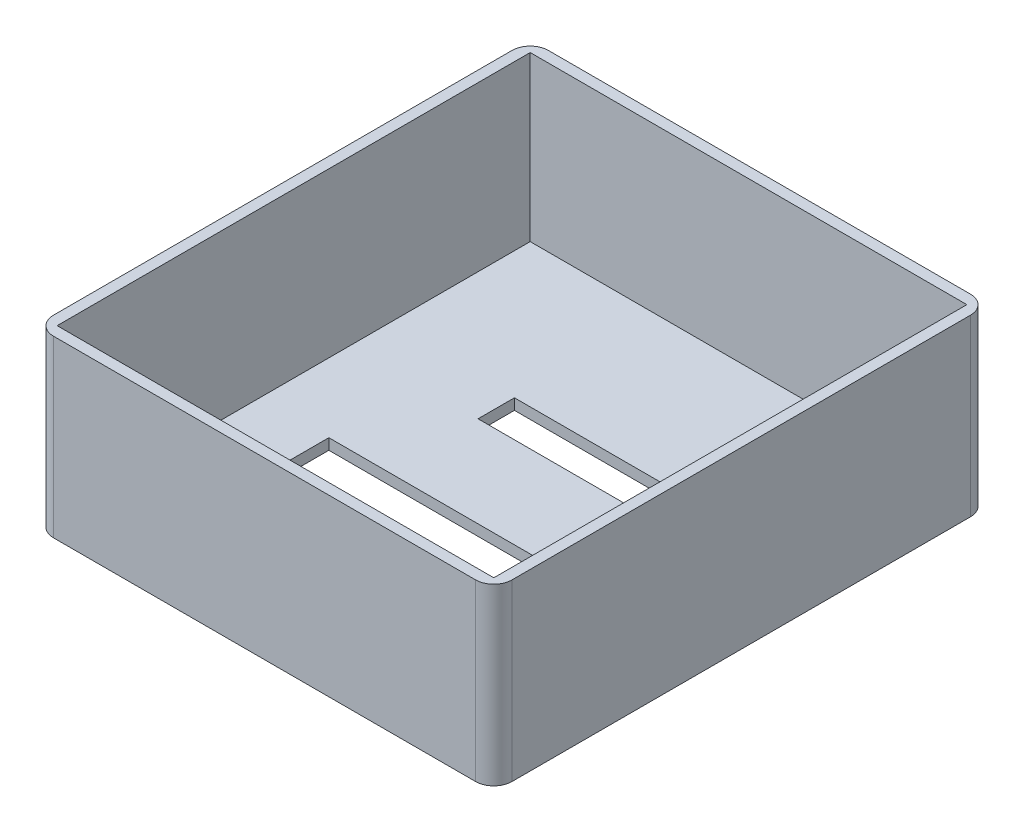
ISO-10303-21;
HEADER;
FILE_DESCRIPTION(('STEP AP214'),'2;1');
FILE_NAME('part.step','',(''),(''),'','','');
FILE_SCHEMA(('AUTOMOTIVE_DESIGN { 1 0 10303 214 1 1 1 1 }'));
ENDSEC;
DATA;
#1=APPLICATION_CONTEXT('core data for automotive mechanical design processes');
#2=APPLICATION_PROTOCOL_DEFINITION('international standard','automotive_design',2000,#1);
#3=PRODUCT_CONTEXT('',#1,'mechanical');
#4=PRODUCT('Part','Part','',(#3));
#5=PRODUCT_RELATED_PRODUCT_CATEGORY('part','',(#4));
#6=PRODUCT_DEFINITION_FORMATION('','',#4);
#7=PRODUCT_DEFINITION_CONTEXT('part definition',#1,'design');
#8=PRODUCT_DEFINITION('design','',#6,#7);
#9=PRODUCT_DEFINITION_SHAPE('','',#8);
#10=(LENGTH_UNIT() NAMED_UNIT(*) SI_UNIT(.MILLI.,.METRE.));
#11=(NAMED_UNIT(*) PLANE_ANGLE_UNIT() SI_UNIT($,.RADIAN.));
#12=(NAMED_UNIT(*) SI_UNIT($,.STERADIAN.) SOLID_ANGLE_UNIT());
#13=UNCERTAINTY_MEASURE_WITH_UNIT(LENGTH_MEASURE(1.E-05),#10,'distance_accuracy_value','');
#14=(GEOMETRIC_REPRESENTATION_CONTEXT(3) GLOBAL_UNCERTAINTY_ASSIGNED_CONTEXT((#13)) GLOBAL_UNIT_ASSIGNED_CONTEXT((#10,
#11,#12)) REPRESENTATION_CONTEXT('',''));
#15=CARTESIAN_POINT('',(0.,0.,0.));
#16=DIRECTION('',(0.,0.,1.));
#17=DIRECTION('',(1.,0.,0.));
#18=AXIS2_PLACEMENT_3D('',#15,#16,#17);
#19=CARTESIAN_POINT('',(63.,3.,-68.));
#20=DIRECTION('',(-1.,0.,0.));
#21=DIRECTION('',(0.,0.,1.));
#22=AXIS2_PLACEMENT_3D('',#19,#20,#21);
#23=PLANE('',#22);
#24=DIRECTION('',(0.,0.,-1.));
#25=VECTOR('',#24,1.);
#26=CARTESIAN_POINT('',(63.,0.,-68.));
#27=LINE('',#26,#25);
#28=CARTESIAN_POINT('',(63.,0.,63.));
#29=VERTEX_POINT('',#28);
#30=CARTESIAN_POINT('',(63.,0.,-63.));
#31=VERTEX_POINT('',#30);
#32=EDGE_CURVE('E273',#29,#31,#27,.T.);
#33=ORIENTED_EDGE('',*,*,#32,.T.);
#34=DIRECTION('',(0.,-1.,0.));
#35=VECTOR('',#34,1.);
#36=CARTESIAN_POINT('',(63.,3.,-63.));
#37=LINE('',#36,#35);
#38=CARTESIAN_POINT('',(63.,48.,-63.));
#39=VERTEX_POINT('',#38);
#40=EDGE_CURVE('E314',#31,#39,#37,.F.);
#41=ORIENTED_EDGE('',*,*,#40,.T.);
#42=DIRECTION('',(0.,0.,-1.));
#43=VECTOR('',#42,1.);
#44=CARTESIAN_POINT('',(63.,48.,-68.));
#45=LINE('',#44,#43);
#46=CARTESIAN_POINT('',(63.,48.,63.));
#47=VERTEX_POINT('',#46);
#48=EDGE_CURVE('E267',#47,#39,#45,.T.);
#49=ORIENTED_EDGE('',*,*,#48,.F.);
#50=DIRECTION('',(0.,-1.,0.));
#51=VECTOR('',#50,1.);
#52=CARTESIAN_POINT('',(63.,3.,63.));
#53=LINE('',#52,#51);
#54=EDGE_CURVE('E311',#47,#29,#53,.T.);
#55=ORIENTED_EDGE('',*,*,#54,.T.);
#56=EDGE_LOOP('',(#33,#41,#49,#55));
#57=FACE_BOUND('',#56,.T.);
#58=ADVANCED_FACE('F35',(#57),#23,.F.);
#59=CARTESIAN_POINT('',(-63.,3.,-68.));
#60=DIRECTION('',(0.,0.,1.));
#61=DIRECTION('',(1.,0.,0.));
#62=AXIS2_PLACEMENT_3D('',#59,#60,#61);
#63=PLANE('',#62);
#64=DIRECTION('',(-1.,0.,0.));
#65=VECTOR('',#64,1.);
#66=CARTESIAN_POINT('',(-63.,0.,-68.));
#67=LINE('',#66,#65);
#68=CARTESIAN_POINT('',(58.,0.,-68.));
#69=VERTEX_POINT('',#68);
#70=CARTESIAN_POINT('',(-58.,0.,-68.));
#71=VERTEX_POINT('',#70);
#72=EDGE_CURVE('E276',#69,#71,#67,.T.);
#73=ORIENTED_EDGE('',*,*,#72,.T.);
#74=DIRECTION('',(0.,-1.,0.));
#75=VECTOR('',#74,1.);
#76=CARTESIAN_POINT('',(-58.,3.,-68.));
#77=LINE('',#76,#75);
#78=CARTESIAN_POINT('',(-58.,48.,-68.));
#79=VERTEX_POINT('',#78);
#80=EDGE_CURVE('E301',#71,#79,#77,.F.);
#81=ORIENTED_EDGE('',*,*,#80,.T.);
#82=DIRECTION('',(-1.,0.,0.));
#83=VECTOR('',#82,1.);
#84=CARTESIAN_POINT('',(-63.,48.,-68.));
#85=LINE('',#84,#83);
#86=CARTESIAN_POINT('',(58.,48.,-68.));
#87=VERTEX_POINT('',#86);
#88=EDGE_CURVE('E270',#87,#79,#85,.T.);
#89=ORIENTED_EDGE('',*,*,#88,.F.);
#90=DIRECTION('',(0.,-1.,0.));
#91=VECTOR('',#90,1.);
#92=CARTESIAN_POINT('',(58.,3.,-68.));
#93=LINE('',#92,#91);
#94=EDGE_CURVE('E298',#87,#69,#93,.T.);
#95=ORIENTED_EDGE('',*,*,#94,.T.);
#96=EDGE_LOOP('',(#73,#81,#89,#95));
#97=FACE_BOUND('',#96,.T.);
#98=ADVANCED_FACE('F342',(#97),#63,.F.);
#99=CARTESIAN_POINT('',(-63.,3.,-68.));
#100=DIRECTION('',(1.,0.,0.));
#101=DIRECTION('',(0.,0.,-1.));
#102=AXIS2_PLACEMENT_3D('',#99,#100,#101);
#103=PLANE('',#102);
#104=DIRECTION('',(0.,0.,1.));
#105=VECTOR('',#104,1.);
#106=CARTESIAN_POINT('',(-63.,48.,-68.));
#107=LINE('',#106,#105);
#108=CARTESIAN_POINT('',(-63.,48.,-63.));
#109=VERTEX_POINT('',#108);
#110=CARTESIAN_POINT('',(-63.,48.,63.));
#111=VERTEX_POINT('',#110);
#112=EDGE_CURVE('E261',#109,#111,#107,.T.);
#113=ORIENTED_EDGE('',*,*,#112,.F.);
#114=DIRECTION('',(0.,-1.,0.));
#115=VECTOR('',#114,1.);
#116=CARTESIAN_POINT('',(-63.,3.,-63.));
#117=LINE('',#116,#115);
#118=CARTESIAN_POINT('',(-63.,0.,-63.));
#119=VERTEX_POINT('',#118);
#120=EDGE_CURVE('E287',#109,#119,#117,.T.);
#121=ORIENTED_EDGE('',*,*,#120,.T.);
#122=DIRECTION('',(0.,0.,1.));
#123=VECTOR('',#122,1.);
#124=CARTESIAN_POINT('',(-63.,0.,-68.));
#125=LINE('',#124,#123);
#126=CARTESIAN_POINT('',(-63.,0.,63.));
#127=VERTEX_POINT('',#126);
#128=EDGE_CURVE('E279',#119,#127,#125,.T.);
#129=ORIENTED_EDGE('',*,*,#128,.T.);
#130=DIRECTION('',(0.,-1.,0.));
#131=VECTOR('',#130,1.);
#132=CARTESIAN_POINT('',(-63.,3.,63.));
#133=LINE('',#132,#131);
#134=EDGE_CURVE('E285',#127,#111,#133,.F.);
#135=ORIENTED_EDGE('',*,*,#134,.T.);
#136=EDGE_LOOP('',(#113,#121,#129,#135));
#137=FACE_BOUND('',#136,.T.);
#138=ADVANCED_FACE('F348',(#137),#103,.F.);
#139=CARTESIAN_POINT('',(-63.,3.,68.));
#140=DIRECTION('',(0.,0.,-1.));
#141=DIRECTION('',(-1.,0.,0.));
#142=AXIS2_PLACEMENT_3D('',#139,#140,#141);
#143=PLANE('',#142);
#144=DIRECTION('',(1.,0.,0.));
#145=VECTOR('',#144,1.);
#146=CARTESIAN_POINT('',(-63.,0.,68.));
#147=LINE('',#146,#145);
#148=CARTESIAN_POINT('',(-58.,0.,68.));
#149=VERTEX_POINT('',#148);
#150=CARTESIAN_POINT('',(58.,0.,68.));
#151=VERTEX_POINT('',#150);
#152=EDGE_CURVE('E282',#149,#151,#147,.T.);
#153=ORIENTED_EDGE('',*,*,#152,.T.);
#154=DIRECTION('',(0.,-1.,0.));
#155=VECTOR('',#154,1.);
#156=CARTESIAN_POINT('',(58.,3.,68.));
#157=LINE('',#156,#155);
#158=CARTESIAN_POINT('',(58.,48.,68.));
#159=VERTEX_POINT('',#158);
#160=EDGE_CURVE('E319',#151,#159,#157,.F.);
#161=ORIENTED_EDGE('',*,*,#160,.T.);
#162=DIRECTION('',(1.,0.,0.));
#163=VECTOR('',#162,1.);
#164=CARTESIAN_POINT('',(-63.,48.,68.));
#165=LINE('',#164,#163);
#166=CARTESIAN_POINT('',(-58.,48.,68.));
#167=VERTEX_POINT('',#166);
#168=EDGE_CURVE('E264',#167,#159,#165,.T.);
#169=ORIENTED_EDGE('',*,*,#168,.F.);
#170=DIRECTION('',(0.,-1.,0.));
#171=VECTOR('',#170,1.);
#172=CARTESIAN_POINT('',(-58.,3.,68.));
#173=LINE('',#172,#171);
#174=EDGE_CURVE('E316',#167,#149,#173,.T.);
#175=ORIENTED_EDGE('',*,*,#174,.T.);
#176=EDGE_LOOP('',(#153,#161,#169,#175));
#177=FACE_BOUND('',#176,.T.);
#178=ADVANCED_FACE('F392',(#177),#143,.F.);
#179=CARTESIAN_POINT('',(0.,0.,0.));
#180=DIRECTION('',(0.,1.,0.));
#181=DIRECTION('',(0.,0.,1.));
#182=AXIS2_PLACEMENT_3D('',#179,#180,#181);
#183=PLANE('',#182);
#184=DIRECTION('',(-1.,0.,0.));
#185=VECTOR('',#184,1.);
#186=CARTESIAN_POINT('',(0.,0.,9.32848748235913));
#187=LINE('',#186,#185);
#188=CARTESIAN_POINT('',(41.,0.,9.32848748235912));
#189=VERTEX_POINT('',#188);
#190=CARTESIAN_POINT('',(-41.,0.,9.32848748235914));
#191=VERTEX_POINT('',#190);
#192=EDGE_CURVE('E43',#189,#191,#187,.T.);
#193=ORIENTED_EDGE('',*,*,#192,.T.);
#194=DIRECTION('',(0.,0.,1.));
#195=VECTOR('',#194,1.);
#196=CARTESIAN_POINT('',(-41.,0.,0.));
#197=LINE('',#196,#195);
#198=CARTESIAN_POINT('',(-41.,0.,32.3284874823591));
#199=VERTEX_POINT('',#198);
#200=EDGE_CURVE('E11',#191,#199,#197,.T.);
#201=ORIENTED_EDGE('',*,*,#200,.T.);
#202=DIRECTION('',(1.,0.,0.));
#203=VECTOR('',#202,1.);
#204=CARTESIAN_POINT('',(0.,0.,32.3284874823591));
#205=LINE('',#204,#203);
#206=CARTESIAN_POINT('',(41.,0.,32.3284874823591));
#207=VERTEX_POINT('',#206);
#208=EDGE_CURVE('E177',#199,#207,#205,.T.);
#209=ORIENTED_EDGE('',*,*,#208,.T.);
#210=DIRECTION('',(0.,0.,-1.));
#211=VECTOR('',#210,1.);
#212=CARTESIAN_POINT('',(41.,0.,0.));
#213=LINE('',#212,#211);
#214=EDGE_CURVE('E322',#207,#189,#213,.T.);
#215=ORIENTED_EDGE('',*,*,#214,.T.);
#216=EDGE_LOOP('',(#193,#201,#209,#215));
#217=FACE_BOUND('',#216,.T.);
#218=DIRECTION('',(-1.,0.,0.));
#219=VECTOR('',#218,1.);
#220=CARTESIAN_POINT('',(0.,0.,-25.6715125176409));
#221=LINE('',#220,#219);
#222=CARTESIAN_POINT('',(25.,0.,-25.6715125176409));
#223=VERTEX_POINT('',#222);
#224=CARTESIAN_POINT('',(-25.,0.,-25.6715125176409));
#225=VERTEX_POINT('',#224);
#226=EDGE_CURVE('E226',#223,#225,#221,.T.);
#227=ORIENTED_EDGE('',*,*,#226,.T.);
#228=DIRECTION('',(0.,0.,1.));
#229=VECTOR('',#228,1.);
#230=CARTESIAN_POINT('',(-25.,0.,0.));
#231=LINE('',#230,#229);
#232=CARTESIAN_POINT('',(-25.,0.,-15.6715125176409));
#233=VERTEX_POINT('',#232);
#234=EDGE_CURVE('E229',#225,#233,#231,.T.);
#235=ORIENTED_EDGE('',*,*,#234,.T.);
#236=DIRECTION('',(1.,0.,0.));
#237=VECTOR('',#236,1.);
#238=CARTESIAN_POINT('',(0.,0.,-15.6715125176409));
#239=LINE('',#238,#237);
#240=CARTESIAN_POINT('',(25.,0.,-15.6715125176409));
#241=VERTEX_POINT('',#240);
#242=EDGE_CURVE('E199',#233,#241,#239,.T.);
#243=ORIENTED_EDGE('',*,*,#242,.T.);
#244=DIRECTION('',(0.,0.,-1.));
#245=VECTOR('',#244,1.);
#246=CARTESIAN_POINT('',(25.,0.,0.));
#247=LINE('',#246,#245);
#248=EDGE_CURVE('E223',#241,#223,#247,.T.);
#249=ORIENTED_EDGE('',*,*,#248,.T.);
#250=EDGE_LOOP('',(#227,#235,#243,#249));
#251=FACE_BOUND('',#250,.T.);
#252=ORIENTED_EDGE('',*,*,#128,.F.);
#253=CARTESIAN_POINT('',(-58.,0.,-63.));
#254=DIRECTION('',(0.,1.,0.));
#255=DIRECTION('',(0.,0.,1.));
#256=AXIS2_PLACEMENT_3D('',#253,#254,#255);
#257=CIRCLE('',#256,5.);
#258=EDGE_CURVE('E296',#119,#71,#257,.F.);
#259=ORIENTED_EDGE('',*,*,#258,.T.);
#260=ORIENTED_EDGE('',*,*,#72,.F.);
#261=CARTESIAN_POINT('',(58.,0.,-63.));
#262=DIRECTION('',(0.,1.,0.));
#263=DIRECTION('',(0.,0.,1.));
#264=AXIS2_PLACEMENT_3D('',#261,#262,#263);
#265=CIRCLE('',#264,5.);
#266=EDGE_CURVE('E294',#69,#31,#265,.F.);
#267=ORIENTED_EDGE('',*,*,#266,.T.);
#268=ORIENTED_EDGE('',*,*,#32,.F.);
#269=CARTESIAN_POINT('',(58.,0.,63.));
#270=DIRECTION('',(0.,1.,0.));
#271=DIRECTION('',(0.,0.,1.));
#272=AXIS2_PLACEMENT_3D('',#269,#270,#271);
#273=CIRCLE('',#272,5.);
#274=EDGE_CURVE('E292',#29,#151,#273,.F.);
#275=ORIENTED_EDGE('',*,*,#274,.T.);
#276=ORIENTED_EDGE('',*,*,#152,.F.);
#277=CARTESIAN_POINT('',(-58.,0.,63.));
#278=DIRECTION('',(0.,1.,0.));
#279=DIRECTION('',(0.,0.,1.));
#280=AXIS2_PLACEMENT_3D('',#277,#278,#279);
#281=CIRCLE('',#280,5.);
#282=EDGE_CURVE('E290',#149,#127,#281,.F.);
#283=ORIENTED_EDGE('',*,*,#282,.T.);
#284=EDGE_LOOP('',(#252,#259,#260,#267,#268,#275,#276,#283));
#285=FACE_BOUND('',#284,.T.);
#286=ADVANCED_FACE('F326',(#217,#251,#285),#183,.F.);
#287=CARTESIAN_POINT('',(0.,48.,0.));
#288=DIRECTION('',(0.,1.,0.));
#289=DIRECTION('',(0.,0.,1.));
#290=AXIS2_PLACEMENT_3D('',#287,#288,#289);
#291=PLANE('',#290);
#292=ORIENTED_EDGE('',*,*,#88,.T.);
#293=CARTESIAN_POINT('',(-58.,48.,-63.));
#294=DIRECTION('',(0.,1.,0.));
#295=DIRECTION('',(0.,0.,1.));
#296=AXIS2_PLACEMENT_3D('',#293,#294,#295);
#297=CIRCLE('',#296,5.);
#298=EDGE_CURVE('E309',#79,#109,#297,.T.);
#299=ORIENTED_EDGE('',*,*,#298,.T.);
#300=ORIENTED_EDGE('',*,*,#112,.T.);
#301=CARTESIAN_POINT('',(-58.,48.,63.));
#302=DIRECTION('',(0.,1.,0.));
#303=DIRECTION('',(0.,0.,1.));
#304=AXIS2_PLACEMENT_3D('',#301,#302,#303);
#305=CIRCLE('',#304,5.);
#306=EDGE_CURVE('E303',#111,#167,#305,.T.);
#307=ORIENTED_EDGE('',*,*,#306,.T.);
#308=ORIENTED_EDGE('',*,*,#168,.T.);
#309=CARTESIAN_POINT('',(58.,48.,63.));
#310=DIRECTION('',(0.,1.,0.));
#311=DIRECTION('',(0.,0.,1.));
#312=AXIS2_PLACEMENT_3D('',#309,#310,#311);
#313=CIRCLE('',#312,5.);
#314=EDGE_CURVE('E305',#159,#47,#313,.T.);
#315=ORIENTED_EDGE('',*,*,#314,.T.);
#316=ORIENTED_EDGE('',*,*,#48,.T.);
#317=CARTESIAN_POINT('',(58.,48.,-63.));
#318=DIRECTION('',(0.,1.,0.));
#319=DIRECTION('',(0.,0.,1.));
#320=AXIS2_PLACEMENT_3D('',#317,#318,#319);
#321=CIRCLE('',#320,5.);
#322=EDGE_CURVE('E307',#39,#87,#321,.T.);
#323=ORIENTED_EDGE('',*,*,#322,.T.);
#324=EDGE_LOOP('',(#292,#299,#300,#307,#308,#315,#316,#323));
#325=FACE_BOUND('',#324,.T.);
#326=DIRECTION('',(-1.,0.,0.));
#327=VECTOR('',#326,1.);
#328=CARTESIAN_POINT('',(-60.,48.,-65.));
#329=LINE('',#328,#327);
#330=CARTESIAN_POINT('',(60.,48.,-65.));
#331=VERTEX_POINT('',#330);
#332=CARTESIAN_POINT('',(-60.,48.,-65.));
#333=VERTEX_POINT('',#332);
#334=EDGE_CURVE('E235',#331,#333,#329,.T.);
#335=ORIENTED_EDGE('',*,*,#334,.F.);
#336=DIRECTION('',(0.,0.,-1.));
#337=VECTOR('',#336,1.);
#338=CARTESIAN_POINT('',(60.,48.,-65.));
#339=LINE('',#338,#337);
#340=CARTESIAN_POINT('',(60.,48.,65.));
#341=VERTEX_POINT('',#340);
#342=EDGE_CURVE('E233',#341,#331,#339,.T.);
#343=ORIENTED_EDGE('',*,*,#342,.F.);
#344=DIRECTION('',(1.,0.,0.));
#345=VECTOR('',#344,1.);
#346=CARTESIAN_POINT('',(-60.,48.,65.));
#347=LINE('',#346,#345);
#348=CARTESIAN_POINT('',(-60.,48.,65.));
#349=VERTEX_POINT('',#348);
#350=EDGE_CURVE('E241',#349,#341,#347,.T.);
#351=ORIENTED_EDGE('',*,*,#350,.F.);
#352=DIRECTION('',(0.,0.,1.));
#353=VECTOR('',#352,1.);
#354=CARTESIAN_POINT('',(-60.,48.,-65.));
#355=LINE('',#354,#353);
#356=EDGE_CURVE('E238',#333,#349,#355,.T.);
#357=ORIENTED_EDGE('',*,*,#356,.F.);
#358=EDGE_LOOP('',(#335,#343,#351,#357));
#359=FACE_BOUND('',#358,.T.);
#360=ADVANCED_FACE('F373',(#325,#359),#291,.T.);
#361=CARTESIAN_POINT('',(60.,48.,-65.));
#362=DIRECTION('',(-1.,0.,0.));
#363=DIRECTION('',(0.,0.,1.));
#364=AXIS2_PLACEMENT_3D('',#361,#362,#363);
#365=PLANE('',#364);
#366=DIRECTION('',(0.,0.,-1.));
#367=VECTOR('',#366,1.);
#368=CARTESIAN_POINT('',(60.,3.,-65.));
#369=LINE('',#368,#367);
#370=CARTESIAN_POINT('',(60.,3.,65.));
#371=VERTEX_POINT('',#370);
#372=CARTESIAN_POINT('',(60.,3.,-65.));
#373=VERTEX_POINT('',#372);
#374=EDGE_CURVE('E232',#371,#373,#369,.T.);
#375=ORIENTED_EDGE('',*,*,#374,.F.);
#376=DIRECTION('',(0.,-1.,0.));
#377=VECTOR('',#376,1.);
#378=CARTESIAN_POINT('',(60.,48.,65.));
#379=LINE('',#378,#377);
#380=EDGE_CURVE('E243',#341,#371,#379,.T.);
#381=ORIENTED_EDGE('',*,*,#380,.F.);
#382=ORIENTED_EDGE('',*,*,#342,.T.);
#383=DIRECTION('',(0.,-1.,0.));
#384=VECTOR('',#383,1.);
#385=CARTESIAN_POINT('',(60.,48.,-65.));
#386=LINE('',#385,#384);
#387=EDGE_CURVE('E258',#331,#373,#386,.T.);
#388=ORIENTED_EDGE('',*,*,#387,.T.);
#389=EDGE_LOOP('',(#375,#381,#382,#388));
#390=FACE_BOUND('',#389,.T.);
#391=ADVANCED_FACE('F401',(#390),#365,.T.);
#392=CARTESIAN_POINT('',(-60.,48.,-65.));
#393=DIRECTION('',(0.,0.,1.));
#394=DIRECTION('',(1.,0.,0.));
#395=AXIS2_PLACEMENT_3D('',#392,#393,#394);
#396=PLANE('',#395);
#397=DIRECTION('',(-1.,0.,0.));
#398=VECTOR('',#397,1.);
#399=CARTESIAN_POINT('',(-60.,3.,-65.));
#400=LINE('',#399,#398);
#401=CARTESIAN_POINT('',(-60.,3.,-65.));
#402=VERTEX_POINT('',#401);
#403=EDGE_CURVE('E245',#373,#402,#400,.T.);
#404=ORIENTED_EDGE('',*,*,#403,.F.);
#405=ORIENTED_EDGE('',*,*,#387,.F.);
#406=ORIENTED_EDGE('',*,*,#334,.T.);
#407=DIRECTION('',(0.,-1.,0.));
#408=VECTOR('',#407,1.);
#409=CARTESIAN_POINT('',(-60.,48.,-65.));
#410=LINE('',#409,#408);
#411=EDGE_CURVE('E255',#333,#402,#410,.T.);
#412=ORIENTED_EDGE('',*,*,#411,.T.);
#413=EDGE_LOOP('',(#404,#405,#406,#412));
#414=FACE_BOUND('',#413,.T.);
#415=ADVANCED_FACE('F532',(#414),#396,.T.);
#416=CARTESIAN_POINT('',(-60.,48.,-65.));
#417=DIRECTION('',(1.,0.,0.));
#418=DIRECTION('',(0.,0.,-1.));
#419=AXIS2_PLACEMENT_3D('',#416,#417,#418);
#420=PLANE('',#419);
#421=DIRECTION('',(0.,0.,1.));
#422=VECTOR('',#421,1.);
#423=CARTESIAN_POINT('',(-60.,3.,-65.));
#424=LINE('',#423,#422);
#425=CARTESIAN_POINT('',(-60.,3.,65.));
#426=VERTEX_POINT('',#425);
#427=EDGE_CURVE('E247',#402,#426,#424,.T.);
#428=ORIENTED_EDGE('',*,*,#427,.F.);
#429=ORIENTED_EDGE('',*,*,#411,.F.);
#430=ORIENTED_EDGE('',*,*,#356,.T.);
#431=DIRECTION('',(0.,-1.,0.));
#432=VECTOR('',#431,1.);
#433=CARTESIAN_POINT('',(-60.,48.,65.));
#434=LINE('',#433,#432);
#435=EDGE_CURVE('E252',#349,#426,#434,.T.);
#436=ORIENTED_EDGE('',*,*,#435,.T.);
#437=EDGE_LOOP('',(#428,#429,#430,#436));
#438=FACE_BOUND('',#437,.T.);
#439=ADVANCED_FACE('F528',(#438),#420,.T.);
#440=CARTESIAN_POINT('',(-60.,48.,65.));
#441=DIRECTION('',(0.,0.,-1.));
#442=DIRECTION('',(-1.,0.,0.));
#443=AXIS2_PLACEMENT_3D('',#440,#441,#442);
#444=PLANE('',#443);
#445=DIRECTION('',(1.,0.,0.));
#446=VECTOR('',#445,1.);
#447=CARTESIAN_POINT('',(-60.,3.,65.));
#448=LINE('',#447,#446);
#449=EDGE_CURVE('E236',#426,#371,#448,.T.);
#450=ORIENTED_EDGE('',*,*,#449,.F.);
#451=ORIENTED_EDGE('',*,*,#435,.F.);
#452=ORIENTED_EDGE('',*,*,#350,.T.);
#453=ORIENTED_EDGE('',*,*,#380,.T.);
#454=EDGE_LOOP('',(#450,#451,#452,#453));
#455=FACE_BOUND('',#454,.T.);
#456=ADVANCED_FACE('F462',(#455),#444,.T.);
#457=CARTESIAN_POINT('',(0.,3.,0.));
#458=DIRECTION('',(0.,1.,0.));
#459=DIRECTION('',(0.,0.,1.));
#460=AXIS2_PLACEMENT_3D('',#457,#458,#459);
#461=PLANE('',#460);
#462=DIRECTION('',(0.,0.,1.));
#463=VECTOR('',#462,1.);
#464=CARTESIAN_POINT('',(-41.,3.,32.3284874823591));
#465=LINE('',#464,#463);
#466=CARTESIAN_POINT('',(-41.,3.,9.32848748235914));
#467=VERTEX_POINT('',#466);
#468=CARTESIAN_POINT('',(-41.,3.,32.3284874823591));
#469=VERTEX_POINT('',#468);
#470=EDGE_CURVE('E182',#467,#469,#465,.T.);
#471=ORIENTED_EDGE('',*,*,#470,.F.);
#472=DIRECTION('',(-1.,0.,0.));
#473=VECTOR('',#472,1.);
#474=CARTESIAN_POINT('',(41.,3.,9.32848748235912));
#475=LINE('',#474,#473);
#476=CARTESIAN_POINT('',(41.,3.,9.32848748235912));
#477=VERTEX_POINT('',#476);
#478=EDGE_CURVE('E179',#477,#467,#475,.T.);
#479=ORIENTED_EDGE('',*,*,#478,.F.);
#480=DIRECTION('',(0.,0.,-1.));
#481=VECTOR('',#480,1.);
#482=CARTESIAN_POINT('',(41.,3.,32.3284874823591));
#483=LINE('',#482,#481);
#484=CARTESIAN_POINT('',(41.,3.,32.3284874823591));
#485=VERTEX_POINT('',#484);
#486=EDGE_CURVE('E193',#485,#477,#483,.T.);
#487=ORIENTED_EDGE('',*,*,#486,.F.);
#488=DIRECTION('',(1.,0.,0.));
#489=VECTOR('',#488,1.);
#490=CARTESIAN_POINT('',(41.,3.,32.3284874823591));
#491=LINE('',#490,#489);
#492=EDGE_CURVE('E174',#469,#485,#491,.T.);
#493=ORIENTED_EDGE('',*,*,#492,.F.);
#494=EDGE_LOOP('',(#471,#479,#487,#493));
#495=FACE_BOUND('',#494,.T.);
#496=DIRECTION('',(0.,0.,1.));
#497=VECTOR('',#496,1.);
#498=CARTESIAN_POINT('',(-25.,3.,-15.6715125176409));
#499=LINE('',#498,#497);
#500=CARTESIAN_POINT('',(-25.,3.,-25.6715125176409));
#501=VERTEX_POINT('',#500);
#502=CARTESIAN_POINT('',(-25.,3.,-15.6715125176409));
#503=VERTEX_POINT('',#502);
#504=EDGE_CURVE('E204',#501,#503,#499,.T.);
#505=ORIENTED_EDGE('',*,*,#504,.F.);
#506=DIRECTION('',(-1.,0.,0.));
#507=VECTOR('',#506,1.);
#508=CARTESIAN_POINT('',(25.,3.,-25.6715125176409));
#509=LINE('',#508,#507);
#510=CARTESIAN_POINT('',(25.,3.,-25.6715125176409));
#511=VERTEX_POINT('',#510);
#512=EDGE_CURVE('E211',#511,#501,#509,.T.);
#513=ORIENTED_EDGE('',*,*,#512,.F.);
#514=DIRECTION('',(0.,0.,-1.));
#515=VECTOR('',#514,1.);
#516=CARTESIAN_POINT('',(25.,3.,-15.6715125176409));
#517=LINE('',#516,#515);
#518=CARTESIAN_POINT('',(25.,3.,-15.6715125176409));
#519=VERTEX_POINT('',#518);
#520=EDGE_CURVE('E208',#519,#511,#517,.T.);
#521=ORIENTED_EDGE('',*,*,#520,.F.);
#522=DIRECTION('',(1.,0.,0.));
#523=VECTOR('',#522,1.);
#524=CARTESIAN_POINT('',(25.,3.,-15.6715125176409));
#525=LINE('',#524,#523);
#526=EDGE_CURVE('E206',#503,#519,#525,.T.);
#527=ORIENTED_EDGE('',*,*,#526,.F.);
#528=EDGE_LOOP('',(#505,#513,#521,#527));
#529=FACE_BOUND('',#528,.T.);
#530=ORIENTED_EDGE('',*,*,#374,.T.);
#531=ORIENTED_EDGE('',*,*,#403,.T.);
#532=ORIENTED_EDGE('',*,*,#427,.T.);
#533=ORIENTED_EDGE('',*,*,#449,.T.);
#534=EDGE_LOOP('',(#530,#531,#532,#533));
#535=FACE_BOUND('',#534,.T.);
#536=ADVANCED_FACE('F191',(#495,#529,#535),#461,.T.);
#537=CARTESIAN_POINT('',(-58.,3.,-63.));
#538=DIRECTION('',(0.,-1.,0.));
#539=DIRECTION('',(0.,0.,-1.));
#540=AXIS2_PLACEMENT_3D('',#537,#538,#539);
#541=CYLINDRICAL_SURFACE('',#540,5.);
#542=ORIENTED_EDGE('',*,*,#298,.F.);
#543=ORIENTED_EDGE('',*,*,#80,.F.);
#544=ORIENTED_EDGE('',*,*,#258,.F.);
#545=ORIENTED_EDGE('',*,*,#120,.F.);
#546=EDGE_LOOP('',(#542,#543,#544,#545));
#547=FACE_BOUND('',#546,.T.);
#548=ADVANCED_FACE('F353',(#547),#541,.T.);
#549=CARTESIAN_POINT('',(58.,3.,-63.));
#550=DIRECTION('',(0.,-1.,0.));
#551=DIRECTION('',(0.,0.,-1.));
#552=AXIS2_PLACEMENT_3D('',#549,#550,#551);
#553=CYLINDRICAL_SURFACE('',#552,5.);
#554=ORIENTED_EDGE('',*,*,#322,.F.);
#555=ORIENTED_EDGE('',*,*,#40,.F.);
#556=ORIENTED_EDGE('',*,*,#266,.F.);
#557=ORIENTED_EDGE('',*,*,#94,.F.);
#558=EDGE_LOOP('',(#554,#555,#556,#557));
#559=FACE_BOUND('',#558,.T.);
#560=ADVANCED_FACE('F356',(#559),#553,.T.);
#561=CARTESIAN_POINT('',(58.,3.,63.));
#562=DIRECTION('',(0.,-1.,0.));
#563=DIRECTION('',(0.,0.,-1.));
#564=AXIS2_PLACEMENT_3D('',#561,#562,#563);
#565=CYLINDRICAL_SURFACE('',#564,5.);
#566=ORIENTED_EDGE('',*,*,#314,.F.);
#567=ORIENTED_EDGE('',*,*,#160,.F.);
#568=ORIENTED_EDGE('',*,*,#274,.F.);
#569=ORIENTED_EDGE('',*,*,#54,.F.);
#570=EDGE_LOOP('',(#566,#567,#568,#569));
#571=FACE_BOUND('',#570,.T.);
#572=ADVANCED_FACE('F359',(#571),#565,.T.);
#573=CARTESIAN_POINT('',(-58.,3.,63.));
#574=DIRECTION('',(0.,-1.,0.));
#575=DIRECTION('',(0.,0.,-1.));
#576=AXIS2_PLACEMENT_3D('',#573,#574,#575);
#577=CYLINDRICAL_SURFACE('',#576,5.);
#578=ORIENTED_EDGE('',*,*,#306,.F.);
#579=ORIENTED_EDGE('',*,*,#134,.F.);
#580=ORIENTED_EDGE('',*,*,#282,.F.);
#581=ORIENTED_EDGE('',*,*,#174,.F.);
#582=EDGE_LOOP('',(#578,#579,#580,#581));
#583=FACE_BOUND('',#582,.T.);
#584=ADVANCED_FACE('F37',(#583),#577,.T.);
#585=CARTESIAN_POINT('',(-25.,-7.,-15.6715125176409));
#586=DIRECTION('',(-1.,0.,0.));
#587=DIRECTION('',(0.,0.,1.));
#588=AXIS2_PLACEMENT_3D('',#585,#586,#587);
#589=PLANE('',#588);
#590=DIRECTION('',(0.,1.,0.));
#591=VECTOR('',#590,1.);
#592=CARTESIAN_POINT('',(-25.,-7.,-25.6715125176409));
#593=LINE('',#592,#591);
#594=EDGE_CURVE('E189',#225,#501,#593,.T.);
#595=ORIENTED_EDGE('',*,*,#594,.T.);
#596=ORIENTED_EDGE('',*,*,#504,.T.);
#597=DIRECTION('',(0.,1.,0.));
#598=VECTOR('',#597,1.);
#599=CARTESIAN_POINT('',(-25.,-7.,-15.6715125176409));
#600=LINE('',#599,#598);
#601=EDGE_CURVE('E214',#233,#503,#600,.T.);
#602=ORIENTED_EDGE('',*,*,#601,.F.);
#603=ORIENTED_EDGE('',*,*,#234,.F.);
#604=EDGE_LOOP('',(#595,#596,#602,#603));
#605=FACE_BOUND('',#604,.T.);
#606=ADVANCED_FACE('F366',(#605),#589,.F.);
#607=CARTESIAN_POINT('',(25.,-7.,-25.6715125176409));
#608=DIRECTION('',(0.,0.,-1.));
#609=DIRECTION('',(-1.,0.,0.));
#610=AXIS2_PLACEMENT_3D('',#607,#608,#609);
#611=PLANE('',#610);
#612=DIRECTION('',(0.,1.,0.));
#613=VECTOR('',#612,1.);
#614=CARTESIAN_POINT('',(25.,-7.,-25.6715125176409));
#615=LINE('',#614,#613);
#616=EDGE_CURVE('E216',#223,#511,#615,.T.);
#617=ORIENTED_EDGE('',*,*,#616,.T.);
#618=ORIENTED_EDGE('',*,*,#512,.T.);
#619=ORIENTED_EDGE('',*,*,#594,.F.);
#620=ORIENTED_EDGE('',*,*,#226,.F.);
#621=EDGE_LOOP('',(#617,#618,#619,#620));
#622=FACE_BOUND('',#621,.T.);
#623=ADVANCED_FACE('F469',(#622),#611,.F.);
#624=CARTESIAN_POINT('',(25.,-7.,-15.6715125176409));
#625=DIRECTION('',(1.,0.,0.));
#626=DIRECTION('',(0.,0.,-1.));
#627=AXIS2_PLACEMENT_3D('',#624,#625,#626);
#628=PLANE('',#627);
#629=DIRECTION('',(0.,1.,0.));
#630=VECTOR('',#629,1.);
#631=CARTESIAN_POINT('',(25.,-7.,-15.6715125176409));
#632=LINE('',#631,#630);
#633=EDGE_CURVE('E58',#241,#519,#632,.T.);
#634=ORIENTED_EDGE('',*,*,#633,.T.);
#635=ORIENTED_EDGE('',*,*,#520,.T.);
#636=ORIENTED_EDGE('',*,*,#616,.F.);
#637=ORIENTED_EDGE('',*,*,#248,.F.);
#638=EDGE_LOOP('',(#634,#635,#636,#637));
#639=FACE_BOUND('',#638,.T.);
#640=ADVANCED_FACE('F479',(#639),#628,.F.);
#641=CARTESIAN_POINT('',(25.,-7.,-15.6715125176409));
#642=DIRECTION('',(0.,0.,1.));
#643=DIRECTION('',(1.,0.,0.));
#644=AXIS2_PLACEMENT_3D('',#641,#642,#643);
#645=PLANE('',#644);
#646=ORIENTED_EDGE('',*,*,#601,.T.);
#647=ORIENTED_EDGE('',*,*,#526,.T.);
#648=ORIENTED_EDGE('',*,*,#633,.F.);
#649=ORIENTED_EDGE('',*,*,#242,.F.);
#650=EDGE_LOOP('',(#646,#647,#648,#649));
#651=FACE_BOUND('',#650,.T.);
#652=ADVANCED_FACE('F489',(#651),#645,.F.);
#653=CARTESIAN_POINT('',(-41.,-7.,32.3284874823591));
#654=DIRECTION('',(-1.,0.,0.));
#655=DIRECTION('',(0.,0.,1.));
#656=AXIS2_PLACEMENT_3D('',#653,#654,#655);
#657=PLANE('',#656);
#658=DIRECTION('',(0.,1.,0.));
#659=VECTOR('',#658,1.);
#660=CARTESIAN_POINT('',(-41.,-7.,9.32848748235914));
#661=LINE('',#660,#659);
#662=EDGE_CURVE('E185',#191,#467,#661,.T.);
#663=ORIENTED_EDGE('',*,*,#662,.T.);
#664=ORIENTED_EDGE('',*,*,#470,.T.);
#665=DIRECTION('',(0.,1.,0.));
#666=VECTOR('',#665,1.);
#667=CARTESIAN_POINT('',(-41.,-7.,32.3284874823591));
#668=LINE('',#667,#666);
#669=EDGE_CURVE('E170',#199,#469,#668,.T.);
#670=ORIENTED_EDGE('',*,*,#669,.F.);
#671=ORIENTED_EDGE('',*,*,#200,.F.);
#672=EDGE_LOOP('',(#663,#664,#670,#671));
#673=FACE_BOUND('',#672,.T.);
#674=ADVANCED_FACE('F183',(#673),#657,.F.);
#675=CARTESIAN_POINT('',(41.,-7.,9.32848748235912));
#676=DIRECTION('',(0.,0.,-1.));
#677=DIRECTION('',(-1.,0.,0.));
#678=AXIS2_PLACEMENT_3D('',#675,#676,#677);
#679=PLANE('',#678);
#680=DIRECTION('',(0.,1.,0.));
#681=VECTOR('',#680,1.);
#682=CARTESIAN_POINT('',(41.,-7.,9.32848748235912));
#683=LINE('',#682,#681);
#684=EDGE_CURVE('E200',#189,#477,#683,.T.);
#685=ORIENTED_EDGE('',*,*,#684,.T.);
#686=ORIENTED_EDGE('',*,*,#478,.T.);
#687=ORIENTED_EDGE('',*,*,#662,.F.);
#688=ORIENTED_EDGE('',*,*,#192,.F.);
#689=EDGE_LOOP('',(#685,#686,#687,#688));
#690=FACE_BOUND('',#689,.T.);
#691=ADVANCED_FACE('F330',(#690),#679,.F.);
#692=CARTESIAN_POINT('',(41.,-7.,32.3284874823591));
#693=DIRECTION('',(1.,0.,0.));
#694=DIRECTION('',(0.,0.,-1.));
#695=AXIS2_PLACEMENT_3D('',#692,#693,#694);
#696=PLANE('',#695);
#697=DIRECTION('',(0.,1.,0.));
#698=VECTOR('',#697,1.);
#699=CARTESIAN_POINT('',(41.,-7.,32.3284874823591));
#700=LINE('',#699,#698);
#701=EDGE_CURVE('E50',#207,#485,#700,.T.);
#702=ORIENTED_EDGE('',*,*,#701,.T.);
#703=ORIENTED_EDGE('',*,*,#486,.T.);
#704=ORIENTED_EDGE('',*,*,#684,.F.);
#705=ORIENTED_EDGE('',*,*,#214,.F.);
#706=EDGE_LOOP('',(#702,#703,#704,#705));
#707=FACE_BOUND('',#706,.T.);
#708=ADVANCED_FACE('F332',(#707),#696,.F.);
#709=CARTESIAN_POINT('',(41.,-7.,32.3284874823591));
#710=DIRECTION('',(0.,0.,1.));
#711=DIRECTION('',(1.,0.,0.));
#712=AXIS2_PLACEMENT_3D('',#709,#710,#711);
#713=PLANE('',#712);
#714=ORIENTED_EDGE('',*,*,#669,.T.);
#715=ORIENTED_EDGE('',*,*,#492,.T.);
#716=ORIENTED_EDGE('',*,*,#701,.F.);
#717=ORIENTED_EDGE('',*,*,#208,.F.);
#718=EDGE_LOOP('',(#714,#715,#716,#717));
#719=FACE_BOUND('',#718,.T.);
#720=ADVANCED_FACE('F172',(#719),#713,.F.);
#721=CLOSED_SHELL('',(#58,#98,#138,#178,#286,#360,#391,#415,#439,#456,#536,#548,#560,#572,#584,
#606,#623,#640,#652,#674,#691,#708,#720));
#722=MANIFOLD_SOLID_BREP('B2',#721);
#723=ADVANCED_BREP_SHAPE_REPRESENTATION('',(#18,#722),#14);
#724=SHAPE_DEFINITION_REPRESENTATION(#9,#723);
ENDSEC;
END-ISO-10303-21;
